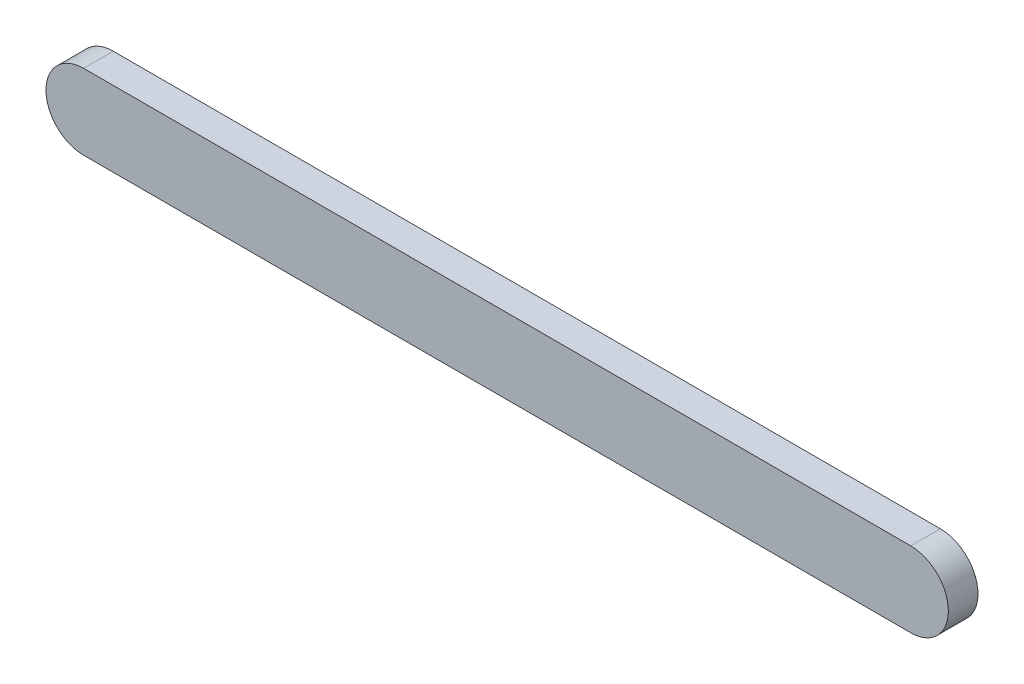
ISO-10303-21;
HEADER;
FILE_DESCRIPTION(('STEP AP214'),'2;1');
FILE_NAME('part.step','',(''),(''),'','','');
FILE_SCHEMA(('AUTOMOTIVE_DESIGN { 1 0 10303 214 1 1 1 1 }'));
ENDSEC;
DATA;
#1=APPLICATION_CONTEXT('core data for automotive mechanical design processes');
#2=APPLICATION_PROTOCOL_DEFINITION('international standard','automotive_design',2000,#1);
#3=PRODUCT_CONTEXT('',#1,'mechanical');
#4=PRODUCT('Part','Part','',(#3));
#5=PRODUCT_RELATED_PRODUCT_CATEGORY('part','',(#4));
#6=PRODUCT_DEFINITION_FORMATION('','',#4);
#7=PRODUCT_DEFINITION_CONTEXT('part definition',#1,'design');
#8=PRODUCT_DEFINITION('design','',#6,#7);
#9=PRODUCT_DEFINITION_SHAPE('','',#8);
#10=(LENGTH_UNIT() NAMED_UNIT(*) SI_UNIT(.MILLI.,.METRE.));
#11=(NAMED_UNIT(*) PLANE_ANGLE_UNIT() SI_UNIT($,.RADIAN.));
#12=(NAMED_UNIT(*) SI_UNIT($,.STERADIAN.) SOLID_ANGLE_UNIT());
#13=UNCERTAINTY_MEASURE_WITH_UNIT(LENGTH_MEASURE(1.E-05),#10,'distance_accuracy_value','');
#14=(GEOMETRIC_REPRESENTATION_CONTEXT(3) GLOBAL_UNCERTAINTY_ASSIGNED_CONTEXT((#13)) GLOBAL_UNIT_ASSIGNED_CONTEXT((#10,
#11,#12)) REPRESENTATION_CONTEXT('',''));
#15=CARTESIAN_POINT('',(0.,0.,0.));
#16=DIRECTION('',(0.,0.,1.));
#17=DIRECTION('',(1.,0.,0.));
#18=AXIS2_PLACEMENT_3D('',#15,#16,#17);
#19=CARTESIAN_POINT('',(125.8634008,66.1859992,0.));
#20=DIRECTION('',(0.,1.,0.));
#21=DIRECTION('',(1.,0.,0.));
#22=AXIS2_PLACEMENT_3D('',#19,#20,#21);
#23=PLANE('',#22);
#24=DIRECTION('',(1.,0.,0.));
#25=VECTOR('',#24,1.);
#26=CARTESIAN_POINT('',(125.8634008,66.1859992,0.1999996));
#27=LINE('',#26,#25);
#28=CARTESIAN_POINT('',(125.8634008,66.1859992,0.1999996));
#29=VERTEX_POINT('',#28);
#30=CARTESIAN_POINT('',(131.445,66.1859992,0.1999996));
#31=VERTEX_POINT('',#30);
#32=EDGE_CURVE('E11',#29,#31,#27,.T.);
#33=ORIENTED_EDGE('',*,*,#32,.F.);
#34=DIRECTION('',(0.,0.,1.));
#35=VECTOR('',#34,1.);
#36=CARTESIAN_POINT('',(125.8634008,66.1859992,0.));
#37=LINE('',#36,#35);
#38=CARTESIAN_POINT('',(125.8634008,66.1859992,0.));
#39=VERTEX_POINT('',#38);
#40=EDGE_CURVE('E24',#39,#29,#37,.T.);
#41=ORIENTED_EDGE('',*,*,#40,.F.);
#42=DIRECTION('',(1.,0.,0.));
#43=VECTOR('',#42,1.);
#44=CARTESIAN_POINT('',(125.8634008,66.1859992,0.));
#45=LINE('',#44,#43);
#46=CARTESIAN_POINT('',(131.445,66.1859992,0.));
#47=VERTEX_POINT('',#46);
#48=EDGE_CURVE('E75',#39,#47,#45,.T.);
#49=ORIENTED_EDGE('',*,*,#48,.T.);
#50=DIRECTION('',(0.,0.,1.));
#51=VECTOR('',#50,1.);
#52=CARTESIAN_POINT('',(131.445,66.1859992,0.));
#53=LINE('',#52,#51);
#54=EDGE_CURVE('E37',#47,#31,#53,.T.);
#55=ORIENTED_EDGE('',*,*,#54,.T.);
#56=EDGE_LOOP('',(#33,#41,#49,#55));
#57=FACE_BOUND('',#56,.T.);
#58=ADVANCED_FACE('F17',(#57),#23,.F.);
#59=CARTESIAN_POINT('',(131.445,66.4399992,0.));
#60=DIRECTION('',(0.,0.,-1.));
#61=DIRECTION('',(-1.11896493820486E-13,-1.,0.));
#62=AXIS2_PLACEMENT_3D('',#59,#60,#61);
#63=CYLINDRICAL_SURFACE('',#62,0.253999999999995);
#64=CARTESIAN_POINT('',(131.445,66.4399992,0.1999996));
#65=DIRECTION('',(0.,0.,1.));
#66=DIRECTION('',(-1.11896493820486E-13,-1.,0.));
#67=AXIS2_PLACEMENT_3D('',#64,#65,#66);
#68=CIRCLE('',#67,0.253999999999995);
#69=CARTESIAN_POINT('',(131.445,66.6939992,0.1999996));
#70=VERTEX_POINT('',#69);
#71=EDGE_CURVE('E83',#31,#70,#68,.T.);
#72=ORIENTED_EDGE('',*,*,#71,.F.);
#73=ORIENTED_EDGE('',*,*,#54,.F.);
#74=CARTESIAN_POINT('',(131.445,66.4399992,0.));
#75=DIRECTION('',(0.,0.,1.));
#76=DIRECTION('',(-1.11896493820486E-13,-1.,0.));
#77=AXIS2_PLACEMENT_3D('',#74,#75,#76);
#78=CIRCLE('',#77,0.253999999999995);
#79=CARTESIAN_POINT('',(131.445,66.6939992,0.));
#80=VERTEX_POINT('',#79);
#81=EDGE_CURVE('E81',#47,#80,#78,.T.);
#82=ORIENTED_EDGE('',*,*,#81,.T.);
#83=DIRECTION('',(0.,0.,1.));
#84=VECTOR('',#83,1.);
#85=CARTESIAN_POINT('',(131.445,66.6939992,0.));
#86=LINE('',#85,#84);
#87=EDGE_CURVE('E67',#80,#70,#86,.T.);
#88=ORIENTED_EDGE('',*,*,#87,.T.);
#89=EDGE_LOOP('',(#72,#73,#82,#88));
#90=FACE_BOUND('',#89,.T.);
#91=ADVANCED_FACE('F89',(#90),#63,.T.);
#92=CARTESIAN_POINT('',(131.445,66.6939992,0.));
#93=DIRECTION('',(0.,-1.,0.));
#94=DIRECTION('',(-1.,0.,0.));
#95=AXIS2_PLACEMENT_3D('',#92,#93,#94);
#96=PLANE('',#95);
#97=DIRECTION('',(-1.,0.,0.));
#98=VECTOR('',#97,1.);
#99=CARTESIAN_POINT('',(131.445,66.6939992,0.1999996));
#100=LINE('',#99,#98);
#101=CARTESIAN_POINT('',(125.8634008,66.6939992,0.1999996));
#102=VERTEX_POINT('',#101);
#103=EDGE_CURVE('E71',#70,#102,#100,.T.);
#104=ORIENTED_EDGE('',*,*,#103,.F.);
#105=ORIENTED_EDGE('',*,*,#87,.F.);
#106=DIRECTION('',(-1.,0.,0.));
#107=VECTOR('',#106,1.);
#108=CARTESIAN_POINT('',(131.445,66.6939992,0.));
#109=LINE('',#108,#107);
#110=CARTESIAN_POINT('',(125.8634008,66.6939992,0.));
#111=VERTEX_POINT('',#110);
#112=EDGE_CURVE('E63',#80,#111,#109,.T.);
#113=ORIENTED_EDGE('',*,*,#112,.T.);
#114=DIRECTION('',(0.,0.,1.));
#115=VECTOR('',#114,1.);
#116=CARTESIAN_POINT('',(125.8634008,66.6939992,0.));
#117=LINE('',#116,#115);
#118=EDGE_CURVE('E53',#111,#102,#117,.T.);
#119=ORIENTED_EDGE('',*,*,#118,.T.);
#120=EDGE_LOOP('',(#104,#105,#113,#119));
#121=FACE_BOUND('',#120,.T.);
#122=ADVANCED_FACE('F66',(#121),#96,.F.);
#123=CARTESIAN_POINT('',(125.8634008,66.4399992,0.));
#124=DIRECTION('',(0.,0.,-1.));
#125=DIRECTION('',(0.,1.,0.));
#126=AXIS2_PLACEMENT_3D('',#123,#124,#125);
#127=CYLINDRICAL_SURFACE('',#126,0.253999999999995);
#128=CARTESIAN_POINT('',(125.8634008,66.4399992,0.1999996));
#129=DIRECTION('',(0.,0.,1.));
#130=DIRECTION('',(0.,1.,0.));
#131=AXIS2_PLACEMENT_3D('',#128,#129,#130);
#132=CIRCLE('',#131,0.253999999999995);
#133=EDGE_CURVE('E59',#102,#29,#132,.T.);
#134=ORIENTED_EDGE('',*,*,#133,.F.);
#135=ORIENTED_EDGE('',*,*,#118,.F.);
#136=CARTESIAN_POINT('',(125.8634008,66.4399992,0.));
#137=DIRECTION('',(0.,0.,1.));
#138=DIRECTION('',(0.,1.,0.));
#139=AXIS2_PLACEMENT_3D('',#136,#137,#138);
#140=CIRCLE('',#139,0.253999999999995);
#141=EDGE_CURVE('E57',#111,#39,#140,.T.);
#142=ORIENTED_EDGE('',*,*,#141,.T.);
#143=ORIENTED_EDGE('',*,*,#40,.T.);
#144=EDGE_LOOP('',(#134,#135,#142,#143));
#145=FACE_BOUND('',#144,.T.);
#146=ADVANCED_FACE('F55',(#145),#127,.T.);
#147=CARTESIAN_POINT('',(125.8634008,66.1859992,0.));
#148=DIRECTION('',(0.,0.,-1.));
#149=DIRECTION('',(-1.,0.,0.));
#150=AXIS2_PLACEMENT_3D('',#147,#148,#149);
#151=PLANE('',#150);
#152=ORIENTED_EDGE('',*,*,#141,.F.);
#153=ORIENTED_EDGE('',*,*,#112,.F.);
#154=ORIENTED_EDGE('',*,*,#81,.F.);
#155=ORIENTED_EDGE('',*,*,#48,.F.);
#156=EDGE_LOOP('',(#152,#153,#154,#155));
#157=FACE_BOUND('',#156,.T.);
#158=ADVANCED_FACE('F74',(#157),#151,.T.);
#159=CARTESIAN_POINT('',(125.8634008,66.1859992,0.1999996));
#160=DIRECTION('',(0.,0.,-1.));
#161=DIRECTION('',(-1.,0.,0.));
#162=AXIS2_PLACEMENT_3D('',#159,#160,#161);
#163=PLANE('',#162);
#164=ORIENTED_EDGE('',*,*,#32,.T.);
#165=ORIENTED_EDGE('',*,*,#71,.T.);
#166=ORIENTED_EDGE('',*,*,#103,.T.);
#167=ORIENTED_EDGE('',*,*,#133,.T.);
#168=EDGE_LOOP('',(#164,#165,#166,#167));
#169=FACE_BOUND('',#168,.T.);
#170=ADVANCED_FACE('F91',(#169),#163,.F.);
#171=CLOSED_SHELL('',(#58,#91,#122,#146,#158,#170));
#172=MANIFOLD_SOLID_BREP('B1',#171);
#173=ADVANCED_BREP_SHAPE_REPRESENTATION('',(#18,#172),#14);
#174=SHAPE_DEFINITION_REPRESENTATION(#9,#173);
ENDSEC;
END-ISO-10303-21;
